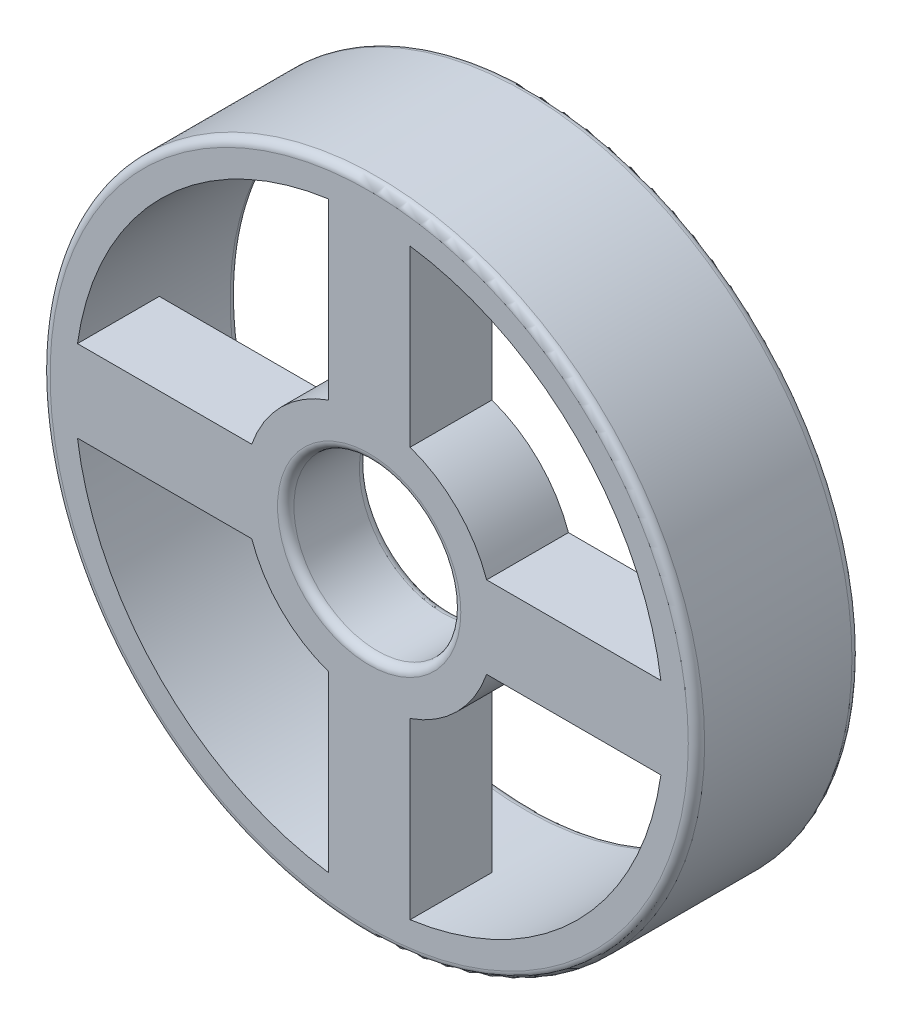
ISO-10303-21;
HEADER;
FILE_DESCRIPTION(('STEP AP214'),'2;1');
FILE_NAME('part.step','',(''),(''),'','','');
FILE_SCHEMA(('AUTOMOTIVE_DESIGN { 1 0 10303 214 1 1 1 1 }'));
ENDSEC;
DATA;
#1=APPLICATION_CONTEXT('core data for automotive mechanical design processes');
#2=APPLICATION_PROTOCOL_DEFINITION('international standard','automotive_design',2000,#1);
#3=PRODUCT_CONTEXT('',#1,'mechanical');
#4=PRODUCT('Part','Part','',(#3));
#5=PRODUCT_RELATED_PRODUCT_CATEGORY('part','',(#4));
#6=PRODUCT_DEFINITION_FORMATION('','',#4);
#7=PRODUCT_DEFINITION_CONTEXT('part definition',#1,'design');
#8=PRODUCT_DEFINITION('design','',#6,#7);
#9=PRODUCT_DEFINITION_SHAPE('','',#8);
#10=(LENGTH_UNIT() NAMED_UNIT(*) SI_UNIT(.MILLI.,.METRE.));
#11=(NAMED_UNIT(*) PLANE_ANGLE_UNIT() SI_UNIT($,.RADIAN.));
#12=(NAMED_UNIT(*) SI_UNIT($,.STERADIAN.) SOLID_ANGLE_UNIT());
#13=UNCERTAINTY_MEASURE_WITH_UNIT(LENGTH_MEASURE(1.E-05),#10,'distance_accuracy_value','');
#14=(GEOMETRIC_REPRESENTATION_CONTEXT(3) GLOBAL_UNCERTAINTY_ASSIGNED_CONTEXT((#13)) GLOBAL_UNIT_ASSIGNED_CONTEXT((#10,
#11,#12)) REPRESENTATION_CONTEXT('',''));
#15=CARTESIAN_POINT('',(0.,0.,0.));
#16=DIRECTION('',(0.,0.,1.));
#17=DIRECTION('',(1.,0.,0.));
#18=AXIS2_PLACEMENT_3D('',#15,#16,#17);
#19=CARTESIAN_POINT('',(-2.5,17.8255434699759,0.));
#20=DIRECTION('',(1.,0.,0.));
#21=DIRECTION('',(0.,1.,0.));
#22=AXIS2_PLACEMENT_3D('',#19,#20,#21);
#23=PLANE('',#22);
#24=DIRECTION('',(0.,1.,0.));
#25=VECTOR('',#24,1.);
#26=CARTESIAN_POINT('',(-2.5,17.8255434699759,5.));
#27=LINE('',#26,#25);
#28=CARTESIAN_POINT('',(-2.5,7.17704674639924,5.));
#29=VERTEX_POINT('',#28);
#30=CARTESIAN_POINT('',(-2.5,17.8255434699759,5.));
#31=VERTEX_POINT('',#30);
#32=EDGE_CURVE('E284',#29,#31,#27,.T.);
#33=ORIENTED_EDGE('',*,*,#32,.F.);
#34=DIRECTION('',(0.,0.,1.));
#35=VECTOR('',#34,1.);
#36=CARTESIAN_POINT('',(-2.5,7.17704674639924,0.));
#37=LINE('',#36,#35);
#38=CARTESIAN_POINT('',(-2.5,7.17704674639924,10.));
#39=VERTEX_POINT('',#38);
#40=EDGE_CURVE('E185',#29,#39,#37,.T.);
#41=ORIENTED_EDGE('',*,*,#40,.T.);
#42=DIRECTION('',(0.,1.,0.));
#43=VECTOR('',#42,1.);
#44=CARTESIAN_POINT('',(-2.5,17.8255434699759,10.));
#45=LINE('',#44,#43);
#46=CARTESIAN_POINT('',(-2.5,17.8255434699759,10.));
#47=VERTEX_POINT('',#46);
#48=EDGE_CURVE('E181',#39,#47,#45,.T.);
#49=ORIENTED_EDGE('',*,*,#48,.T.);
#50=DIRECTION('',(0.,0.,1.));
#51=VECTOR('',#50,1.);
#52=CARTESIAN_POINT('',(-2.5,17.8255434699759,0.));
#53=LINE('',#52,#51);
#54=EDGE_CURVE('E196',#31,#47,#53,.T.);
#55=ORIENTED_EDGE('',*,*,#54,.F.);
#56=EDGE_LOOP('',(#33,#41,#49,#55));
#57=FACE_BOUND('',#56,.T.);
#58=ADVANCED_FACE('F39',(#57),#23,.F.);
#59=CARTESIAN_POINT('',(1.06251812903579E-13,-1.06685493772574E-13,0.));
#60=DIRECTION('',(0.,0.,1.));
#61=DIRECTION('',(1.,0.,0.));
#62=AXIS2_PLACEMENT_3D('',#59,#60,#61);
#63=CYLINDRICAL_SURFACE('',#62,7.60000000000013);
#64=CARTESIAN_POINT('',(1.06251812903579E-13,-1.06685493772574E-13,5.));
#65=DIRECTION('',(0.,0.,-1.));
#66=DIRECTION('',(-1.,0.,0.));
#67=AXIS2_PLACEMENT_3D('',#64,#65,#66);
#68=CIRCLE('',#67,7.60000000000013);
#69=CARTESIAN_POINT('',(-7.17704674639924,2.50000000000001,5.));
#70=VERTEX_POINT('',#69);
#71=EDGE_CURVE('E173',#70,#29,#68,.T.);
#72=ORIENTED_EDGE('',*,*,#71,.F.);
#73=DIRECTION('',(0.,0.,1.));
#74=VECTOR('',#73,1.);
#75=CARTESIAN_POINT('',(-7.17704674639924,2.50000000000001,0.));
#76=LINE('',#75,#74);
#77=CARTESIAN_POINT('',(-7.17704674639924,2.50000000000001,10.));
#78=VERTEX_POINT('',#77);
#79=EDGE_CURVE('E171',#70,#78,#76,.T.);
#80=ORIENTED_EDGE('',*,*,#79,.T.);
#81=CARTESIAN_POINT('',(1.06251812903579E-13,-1.06685493772574E-13,10.));
#82=DIRECTION('',(0.,0.,-1.));
#83=DIRECTION('',(-1.,0.,0.));
#84=AXIS2_PLACEMENT_3D('',#81,#82,#83);
#85=CIRCLE('',#84,7.60000000000013);
#86=EDGE_CURVE('E188',#78,#39,#85,.T.);
#87=ORIENTED_EDGE('',*,*,#86,.T.);
#88=ORIENTED_EDGE('',*,*,#40,.F.);
#89=EDGE_LOOP('',(#72,#80,#87,#88));
#90=FACE_BOUND('',#89,.T.);
#91=ADVANCED_FACE('F286',(#90),#63,.T.);
#92=CARTESIAN_POINT('',(-7.17704674639924,2.50000000000001,0.));
#93=DIRECTION('',(0.,-1.,0.));
#94=DIRECTION('',(0.,0.,-1.));
#95=AXIS2_PLACEMENT_3D('',#92,#93,#94);
#96=PLANE('',#95);
#97=DIRECTION('',(1.,0.,0.));
#98=VECTOR('',#97,1.);
#99=CARTESIAN_POINT('',(-7.17704674639924,2.50000000000001,5.));
#100=LINE('',#99,#98);
#101=CARTESIAN_POINT('',(-17.825543469976,2.50000000000001,5.));
#102=VERTEX_POINT('',#101);
#103=EDGE_CURVE('E155',#102,#70,#100,.T.);
#104=ORIENTED_EDGE('',*,*,#103,.F.);
#105=DIRECTION('',(0.,0.,1.));
#106=VECTOR('',#105,1.);
#107=CARTESIAN_POINT('',(-17.8255434699759,2.50000000000001,0.));
#108=LINE('',#107,#106);
#109=CARTESIAN_POINT('',(-17.8255434699759,2.50000000000001,10.));
#110=VERTEX_POINT('',#109);
#111=EDGE_CURVE('E169',#102,#110,#108,.T.);
#112=ORIENTED_EDGE('',*,*,#111,.T.);
#113=DIRECTION('',(1.,0.,0.));
#114=VECTOR('',#113,1.);
#115=CARTESIAN_POINT('',(-7.17704674639924,2.50000000000001,10.));
#116=LINE('',#115,#114);
#117=EDGE_CURVE('E263',#110,#78,#116,.T.);
#118=ORIENTED_EDGE('',*,*,#117,.T.);
#119=ORIENTED_EDGE('',*,*,#79,.F.);
#120=EDGE_LOOP('',(#104,#112,#118,#119));
#121=FACE_BOUND('',#120,.T.);
#122=ADVANCED_FACE('F167',(#121),#96,.F.);
#123=CARTESIAN_POINT('',(1.45283091113058E-13,1.45283091113058E-13,0.));
#124=DIRECTION('',(0.,0.,1.));
#125=DIRECTION('',(1.,0.,0.));
#126=AXIS2_PLACEMENT_3D('',#123,#124,#125);
#127=CYLINDRICAL_SURFACE('',#126,7.60000000000018);
#128=CARTESIAN_POINT('',(1.45283091113058E-13,1.45283091113058E-13,5.));
#129=DIRECTION('',(0.,0.,-1.));
#130=DIRECTION('',(-1.,0.,0.));
#131=AXIS2_PLACEMENT_3D('',#128,#129,#130);
#132=CIRCLE('',#131,7.60000000000018);
#133=CARTESIAN_POINT('',(-2.50000000000001,-7.17704674639924,5.));
#134=VERTEX_POINT('',#133);
#135=CARTESIAN_POINT('',(-7.17704674639924,-2.50000000000001,5.));
#136=VERTEX_POINT('',#135);
#137=EDGE_CURVE('E392',#134,#136,#132,.T.);
#138=ORIENTED_EDGE('',*,*,#137,.F.);
#139=DIRECTION('',(0.,0.,1.));
#140=VECTOR('',#139,1.);
#141=CARTESIAN_POINT('',(-2.50000000000001,-7.17704674639924,0.));
#142=LINE('',#141,#140);
#143=CARTESIAN_POINT('',(-2.50000000000001,-7.17704674639924,10.));
#144=VERTEX_POINT('',#143);
#145=EDGE_CURVE('E296',#134,#144,#142,.T.);
#146=ORIENTED_EDGE('',*,*,#145,.T.);
#147=CARTESIAN_POINT('',(1.45283091113058E-13,1.45283091113058E-13,10.));
#148=DIRECTION('',(0.,0.,-1.));
#149=DIRECTION('',(-1.,0.,0.));
#150=AXIS2_PLACEMENT_3D('',#147,#148,#149);
#151=CIRCLE('',#150,7.60000000000018);
#152=CARTESIAN_POINT('',(-7.17704674639924,-2.50000000000001,10.));
#153=VERTEX_POINT('',#152);
#154=EDGE_CURVE('E260',#144,#153,#151,.T.);
#155=ORIENTED_EDGE('',*,*,#154,.T.);
#156=DIRECTION('',(0.,0.,1.));
#157=VECTOR('',#156,1.);
#158=CARTESIAN_POINT('',(-7.17704674639924,-2.50000000000001,0.));
#159=LINE('',#158,#157);
#160=EDGE_CURVE('E334',#136,#153,#159,.T.);
#161=ORIENTED_EDGE('',*,*,#160,.F.);
#162=EDGE_LOOP('',(#138,#146,#155,#161));
#163=FACE_BOUND('',#162,.T.);
#164=ADVANCED_FACE('F403',(#163),#127,.T.);
#165=CARTESIAN_POINT('',(-2.50000000000001,-7.17704674639924,0.));
#166=DIRECTION('',(1.,0.,0.));
#167=DIRECTION('',(0.,0.,-1.));
#168=AXIS2_PLACEMENT_3D('',#165,#166,#167);
#169=PLANE('',#168);
#170=DIRECTION('',(0.,1.,0.));
#171=VECTOR('',#170,1.);
#172=CARTESIAN_POINT('',(-2.50000000000001,-7.17704674639924,5.));
#173=LINE('',#172,#171);
#174=CARTESIAN_POINT('',(-2.50000000000003,-17.825543469976,5.));
#175=VERTEX_POINT('',#174);
#176=EDGE_CURVE('E174',#175,#134,#173,.T.);
#177=ORIENTED_EDGE('',*,*,#176,.F.);
#178=DIRECTION('',(0.,0.,1.));
#179=VECTOR('',#178,1.);
#180=CARTESIAN_POINT('',(-2.50000000000002,-17.8255434699759,0.));
#181=LINE('',#180,#179);
#182=CARTESIAN_POINT('',(-2.50000000000002,-17.8255434699759,10.));
#183=VERTEX_POINT('',#182);
#184=EDGE_CURVE('E337',#175,#183,#181,.T.);
#185=ORIENTED_EDGE('',*,*,#184,.T.);
#186=DIRECTION('',(0.,1.,0.));
#187=VECTOR('',#186,1.);
#188=CARTESIAN_POINT('',(-2.50000000000001,-7.17704674639924,10.));
#189=LINE('',#188,#187);
#190=EDGE_CURVE('E330',#183,#144,#189,.T.);
#191=ORIENTED_EDGE('',*,*,#190,.T.);
#192=ORIENTED_EDGE('',*,*,#145,.F.);
#193=EDGE_LOOP('',(#177,#185,#191,#192));
#194=FACE_BOUND('',#193,.T.);
#195=ADVANCED_FACE('F404',(#194),#169,.F.);
#196=CARTESIAN_POINT('',(-7.17704674639924,-2.50000000000001,0.));
#197=DIRECTION('',(0.,1.,0.));
#198=DIRECTION('',(0.,0.,1.));
#199=AXIS2_PLACEMENT_3D('',#196,#197,#198);
#200=PLANE('',#199);
#201=DIRECTION('',(-1.,0.,0.));
#202=VECTOR('',#201,1.);
#203=CARTESIAN_POINT('',(-7.17704674639924,-2.50000000000001,5.));
#204=LINE('',#203,#202);
#205=CARTESIAN_POINT('',(-17.825543469976,-2.50000000000001,5.));
#206=VERTEX_POINT('',#205);
#207=EDGE_CURVE('E158',#136,#206,#204,.T.);
#208=ORIENTED_EDGE('',*,*,#207,.F.);
#209=ORIENTED_EDGE('',*,*,#160,.T.);
#210=DIRECTION('',(-1.,0.,0.));
#211=VECTOR('',#210,1.);
#212=CARTESIAN_POINT('',(-7.17704674639924,-2.50000000000001,10.));
#213=LINE('',#212,#211);
#214=CARTESIAN_POINT('',(-17.8255434699759,-2.50000000000001,10.));
#215=VERTEX_POINT('',#214);
#216=EDGE_CURVE('E322',#153,#215,#213,.T.);
#217=ORIENTED_EDGE('',*,*,#216,.T.);
#218=DIRECTION('',(0.,0.,1.));
#219=VECTOR('',#218,1.);
#220=CARTESIAN_POINT('',(-17.8255434699759,-2.50000000000001,0.));
#221=LINE('',#220,#219);
#222=EDGE_CURVE('E340',#206,#215,#221,.T.);
#223=ORIENTED_EDGE('',*,*,#222,.F.);
#224=EDGE_LOOP('',(#208,#209,#217,#223));
#225=FACE_BOUND('',#224,.T.);
#226=ADVANCED_FACE('F407',(#225),#200,.F.);
#227=CARTESIAN_POINT('',(0.,0.,0.));
#228=DIRECTION('',(0.,0.,1.));
#229=DIRECTION('',(1.,0.,0.));
#230=AXIS2_PLACEMENT_3D('',#227,#228,#229);
#231=CYLINDRICAL_SURFACE('',#230,7.6);
#232=CARTESIAN_POINT('',(0.,0.,5.));
#233=DIRECTION('',(0.,0.,-1.));
#234=DIRECTION('',(-1.,0.,0.));
#235=AXIS2_PLACEMENT_3D('',#232,#233,#234);
#236=CIRCLE('',#235,7.6);
#237=CARTESIAN_POINT('',(7.17704674639924,-2.50000000000001,5.));
#238=VERTEX_POINT('',#237);
#239=CARTESIAN_POINT('',(2.50000000000001,-7.17704674639924,5.));
#240=VERTEX_POINT('',#239);
#241=EDGE_CURVE('E381',#238,#240,#236,.T.);
#242=ORIENTED_EDGE('',*,*,#241,.F.);
#243=DIRECTION('',(0.,0.,1.));
#244=VECTOR('',#243,1.);
#245=CARTESIAN_POINT('',(7.17704674639924,-2.50000000000001,0.));
#246=LINE('',#245,#244);
#247=CARTESIAN_POINT('',(7.17704674639924,-2.50000000000001,10.));
#248=VERTEX_POINT('',#247);
#249=EDGE_CURVE('E309',#238,#248,#246,.T.);
#250=ORIENTED_EDGE('',*,*,#249,.T.);
#251=CARTESIAN_POINT('',(0.,0.,10.));
#252=DIRECTION('',(0.,0.,-1.));
#253=DIRECTION('',(1.,0.,0.));
#254=AXIS2_PLACEMENT_3D('',#251,#252,#253);
#255=CIRCLE('',#254,7.6);
#256=CARTESIAN_POINT('',(2.50000000000001,-7.17704674639924,10.));
#257=VERTEX_POINT('',#256);
#258=EDGE_CURVE('E254',#248,#257,#255,.T.);
#259=ORIENTED_EDGE('',*,*,#258,.T.);
#260=DIRECTION('',(0.,0.,1.));
#261=VECTOR('',#260,1.);
#262=CARTESIAN_POINT('',(2.50000000000001,-7.17704674639924,0.));
#263=LINE('',#262,#261);
#264=EDGE_CURVE('E308',#240,#257,#263,.T.);
#265=ORIENTED_EDGE('',*,*,#264,.F.);
#266=EDGE_LOOP('',(#242,#250,#259,#265));
#267=FACE_BOUND('',#266,.T.);
#268=ADVANCED_FACE('F409',(#267),#231,.T.);
#269=CARTESIAN_POINT('',(7.17704674639924,-2.50000000000001,0.));
#270=DIRECTION('',(0.,1.,0.));
#271=DIRECTION('',(0.,0.,1.));
#272=AXIS2_PLACEMENT_3D('',#269,#270,#271);
#273=PLANE('',#272);
#274=DIRECTION('',(-1.,0.,0.));
#275=VECTOR('',#274,1.);
#276=CARTESIAN_POINT('',(7.17704674639924,-2.50000000000001,5.));
#277=LINE('',#276,#275);
#278=CARTESIAN_POINT('',(17.8255434699759,-2.50000000000001,5.));
#279=VERTEX_POINT('',#278);
#280=EDGE_CURVE('E387',#279,#238,#277,.T.);
#281=ORIENTED_EDGE('',*,*,#280,.F.);
#282=DIRECTION('',(0.,0.,1.));
#283=VECTOR('',#282,1.);
#284=CARTESIAN_POINT('',(17.8255434699759,-2.50000000000001,0.));
#285=LINE('',#284,#283);
#286=CARTESIAN_POINT('',(17.8255434699759,-2.50000000000001,10.));
#287=VERTEX_POINT('',#286);
#288=EDGE_CURVE('E312',#279,#287,#285,.T.);
#289=ORIENTED_EDGE('',*,*,#288,.T.);
#290=DIRECTION('',(-1.,0.,0.));
#291=VECTOR('',#290,1.);
#292=CARTESIAN_POINT('',(7.17704674639924,-2.50000000000001,10.));
#293=LINE('',#292,#291);
#294=EDGE_CURVE('E304',#287,#248,#293,.T.);
#295=ORIENTED_EDGE('',*,*,#294,.T.);
#296=ORIENTED_EDGE('',*,*,#249,.F.);
#297=EDGE_LOOP('',(#281,#289,#295,#296));
#298=FACE_BOUND('',#297,.T.);
#299=ADVANCED_FACE('F415',(#298),#273,.F.);
#300=CARTESIAN_POINT('',(2.50000000000001,-7.17704674639924,0.));
#301=DIRECTION('',(-1.,0.,0.));
#302=DIRECTION('',(0.,-1.,0.));
#303=AXIS2_PLACEMENT_3D('',#300,#301,#302);
#304=PLANE('',#303);
#305=DIRECTION('',(0.,-1.,0.));
#306=VECTOR('',#305,1.);
#307=CARTESIAN_POINT('',(2.50000000000001,-7.17704674639924,5.));
#308=LINE('',#307,#306);
#309=CARTESIAN_POINT('',(2.50000000000001,-17.825543469976,5.));
#310=VERTEX_POINT('',#309);
#311=EDGE_CURVE('E377',#240,#310,#308,.T.);
#312=ORIENTED_EDGE('',*,*,#311,.F.);
#313=ORIENTED_EDGE('',*,*,#264,.T.);
#314=DIRECTION('',(0.,-1.,0.));
#315=VECTOR('',#314,1.);
#316=CARTESIAN_POINT('',(2.50000000000001,-7.17704674639924,10.));
#317=LINE('',#316,#315);
#318=CARTESIAN_POINT('',(2.50000000000002,-17.8255434699759,10.));
#319=VERTEX_POINT('',#318);
#320=EDGE_CURVE('E295',#257,#319,#317,.T.);
#321=ORIENTED_EDGE('',*,*,#320,.T.);
#322=DIRECTION('',(0.,0.,1.));
#323=VECTOR('',#322,1.);
#324=CARTESIAN_POINT('',(2.50000000000002,-17.8255434699759,0.));
#325=LINE('',#324,#323);
#326=EDGE_CURVE('E315',#310,#319,#325,.T.);
#327=ORIENTED_EDGE('',*,*,#326,.F.);
#328=EDGE_LOOP('',(#312,#313,#321,#327));
#329=FACE_BOUND('',#328,.T.);
#330=ADVANCED_FACE('F528',(#329),#304,.F.);
#331=CARTESIAN_POINT('',(0.,0.,0.));
#332=DIRECTION('',(0.,0.,1.));
#333=DIRECTION('',(1.,0.,0.));
#334=AXIS2_PLACEMENT_3D('',#331,#332,#333);
#335=CYLINDRICAL_SURFACE('',#334,5.1);
#336=CARTESIAN_POINT('',(0.,0.,5.5));
#337=DIRECTION('',(0.,0.,-1.));
#338=DIRECTION('',(-1.,0.,0.));
#339=AXIS2_PLACEMENT_3D('',#336,#337,#338);
#340=CIRCLE('',#339,5.1);
#341=CARTESIAN_POINT('',(-5.1,0.,5.5));
#342=VERTEX_POINT('',#341);
#343=EDGE_CURVE('E204',#342,#342,#340,.T.);
#344=ORIENTED_EDGE('',*,*,#343,.T.);
#345=EDGE_LOOP('',(#344));
#346=FACE_BOUND('',#345,.T.);
#347=CARTESIAN_POINT('',(0.,0.,9.5));
#348=DIRECTION('',(0.,0.,1.));
#349=DIRECTION('',(1.,0.,0.));
#350=AXIS2_PLACEMENT_3D('',#347,#348,#349);
#351=CIRCLE('',#350,5.1);
#352=CARTESIAN_POINT('',(5.1,0.,9.5));
#353=VERTEX_POINT('',#352);
#354=EDGE_CURVE('E200',#353,#353,#351,.T.);
#355=ORIENTED_EDGE('',*,*,#354,.T.);
#356=EDGE_LOOP('',(#355));
#357=FACE_BOUND('',#356,.T.);
#358=ADVANCED_FACE('F427',(#346,#357),#335,.F.);
#359=CARTESIAN_POINT('',(7.17704674639924,2.50000000000001,0.));
#360=DIRECTION('',(0.,-1.,0.));
#361=DIRECTION('',(0.,0.,-1.));
#362=AXIS2_PLACEMENT_3D('',#359,#360,#361);
#363=PLANE('',#362);
#364=DIRECTION('',(1.,0.,0.));
#365=VECTOR('',#364,1.);
#366=CARTESIAN_POINT('',(7.17704674639924,2.50000000000001,5.));
#367=LINE('',#366,#365);
#368=CARTESIAN_POINT('',(7.17704674639924,2.50000000000001,5.));
#369=VERTEX_POINT('',#368);
#370=CARTESIAN_POINT('',(17.8255434699759,2.50000000000001,5.));
#371=VERTEX_POINT('',#370);
#372=EDGE_CURVE('E374',#369,#371,#367,.T.);
#373=ORIENTED_EDGE('',*,*,#372,.F.);
#374=DIRECTION('',(0.,0.,1.));
#375=VECTOR('',#374,1.);
#376=CARTESIAN_POINT('',(7.17704674639924,2.50000000000001,0.));
#377=LINE('',#376,#375);
#378=CARTESIAN_POINT('',(7.17704674639924,2.50000000000001,10.));
#379=VERTEX_POINT('',#378);
#380=EDGE_CURVE('E270',#369,#379,#377,.T.);
#381=ORIENTED_EDGE('',*,*,#380,.T.);
#382=DIRECTION('',(1.,0.,0.));
#383=VECTOR('',#382,1.);
#384=CARTESIAN_POINT('',(7.17704674639924,2.50000000000001,10.));
#385=LINE('',#384,#383);
#386=CARTESIAN_POINT('',(17.8255434699759,2.50000000000001,10.));
#387=VERTEX_POINT('',#386);
#388=EDGE_CURVE('E354',#379,#387,#385,.T.);
#389=ORIENTED_EDGE('',*,*,#388,.T.);
#390=DIRECTION('',(0.,0.,1.));
#391=VECTOR('',#390,1.);
#392=CARTESIAN_POINT('',(17.8255434699759,2.50000000000001,0.));
#393=LINE('',#392,#391);
#394=EDGE_CURVE('E265',#371,#387,#393,.T.);
#395=ORIENTED_EDGE('',*,*,#394,.F.);
#396=EDGE_LOOP('',(#373,#381,#389,#395));
#397=FACE_BOUND('',#396,.T.);
#398=ADVANCED_FACE('F373',(#397),#363,.F.);
#399=CARTESIAN_POINT('',(-1.24032728532342E-13,-1.24466409401336E-13,0.));
#400=DIRECTION('',(0.,0.,1.));
#401=DIRECTION('',(1.,0.,0.));
#402=AXIS2_PLACEMENT_3D('',#399,#400,#401);
#403=CYLINDRICAL_SURFACE('',#402,7.60000000000016);
#404=CARTESIAN_POINT('',(-1.24032728532342E-13,-1.24466409401336E-13,5.));
#405=DIRECTION('',(0.,0.,-1.));
#406=DIRECTION('',(-1.,0.,0.));
#407=AXIS2_PLACEMENT_3D('',#404,#405,#406);
#408=CIRCLE('',#407,7.60000000000016);
#409=CARTESIAN_POINT('',(2.5,7.17704674639925,5.));
#410=VERTEX_POINT('',#409);
#411=EDGE_CURVE('E368',#410,#369,#408,.T.);
#412=ORIENTED_EDGE('',*,*,#411,.F.);
#413=DIRECTION('',(0.,0.,1.));
#414=VECTOR('',#413,1.);
#415=CARTESIAN_POINT('',(2.5,7.17704674639924,0.));
#416=LINE('',#415,#414);
#417=CARTESIAN_POINT('',(2.5,7.17704674639924,10.));
#418=VERTEX_POINT('',#417);
#419=EDGE_CURVE('E359',#410,#418,#416,.T.);
#420=ORIENTED_EDGE('',*,*,#419,.T.);
#421=CARTESIAN_POINT('',(-1.24032728532342E-13,-1.24466409401336E-13,10.));
#422=DIRECTION('',(0.,0.,-1.));
#423=DIRECTION('',(-1.,0.,0.));
#424=AXIS2_PLACEMENT_3D('',#421,#422,#423);
#425=CIRCLE('',#424,7.60000000000016);
#426=EDGE_CURVE('E350',#418,#379,#425,.T.);
#427=ORIENTED_EDGE('',*,*,#426,.T.);
#428=ORIENTED_EDGE('',*,*,#380,.F.);
#429=EDGE_LOOP('',(#412,#420,#427,#428));
#430=FACE_BOUND('',#429,.T.);
#431=ADVANCED_FACE('F365',(#430),#403,.T.);
#432=CARTESIAN_POINT('',(2.5,17.8255434699759,0.));
#433=DIRECTION('',(-1.,0.,0.));
#434=DIRECTION('',(0.,-1.,0.));
#435=AXIS2_PLACEMENT_3D('',#432,#433,#434);
#436=PLANE('',#435);
#437=DIRECTION('',(0.,-1.,0.));
#438=VECTOR('',#437,1.);
#439=CARTESIAN_POINT('',(2.5,17.8255434699759,5.));
#440=LINE('',#439,#438);
#441=CARTESIAN_POINT('',(2.5,17.8255434699759,5.));
#442=VERTEX_POINT('',#441);
#443=EDGE_CURVE('E192',#442,#410,#440,.T.);
#444=ORIENTED_EDGE('',*,*,#443,.F.);
#445=DIRECTION('',(0.,0.,1.));
#446=VECTOR('',#445,1.);
#447=CARTESIAN_POINT('',(2.5,17.8255434699759,0.));
#448=LINE('',#447,#446);
#449=CARTESIAN_POINT('',(2.5,17.8255434699759,10.));
#450=VERTEX_POINT('',#449);
#451=EDGE_CURVE('E62',#442,#450,#448,.T.);
#452=ORIENTED_EDGE('',*,*,#451,.T.);
#453=DIRECTION('',(0.,-1.,0.));
#454=VECTOR('',#453,1.);
#455=CARTESIAN_POINT('',(2.5,17.8255434699759,10.));
#456=LINE('',#455,#454);
#457=EDGE_CURVE('E347',#450,#418,#456,.T.);
#458=ORIENTED_EDGE('',*,*,#457,.T.);
#459=ORIENTED_EDGE('',*,*,#419,.F.);
#460=EDGE_LOOP('',(#444,#452,#458,#459));
#461=FACE_BOUND('',#460,.T.);
#462=ADVANCED_FACE('F369',(#461),#436,.F.);
#463=CARTESIAN_POINT('',(0.,0.,10.));
#464=DIRECTION('',(0.,0.,-1.));
#465=DIRECTION('',(-1.,0.,0.));
#466=AXIS2_PLACEMENT_3D('',#463,#464,#465);
#467=CYLINDRICAL_SURFACE('',#466,20.);
#468=CARTESIAN_POINT('',(0.,0.,0.5));
#469=DIRECTION('',(0.,0.,1.));
#470=DIRECTION('',(1.,0.,0.));
#471=AXIS2_PLACEMENT_3D('',#468,#469,#470);
#472=CIRCLE('',#471,20.);
#473=CARTESIAN_POINT('',(20.,0.,0.5));
#474=VERTEX_POINT('',#473);
#475=EDGE_CURVE('E11',#474,#474,#472,.T.);
#476=ORIENTED_EDGE('',*,*,#475,.T.);
#477=EDGE_LOOP('',(#476));
#478=FACE_BOUND('',#477,.T.);
#479=CARTESIAN_POINT('',(0.,0.,9.5));
#480=DIRECTION('',(0.,0.,1.));
#481=DIRECTION('',(1.,0.,0.));
#482=AXIS2_PLACEMENT_3D('',#479,#480,#481);
#483=CIRCLE('',#482,20.);
#484=CARTESIAN_POINT('',(20.,0.,9.5));
#485=VERTEX_POINT('',#484);
#486=EDGE_CURVE('E48',#485,#485,#483,.F.);
#487=ORIENTED_EDGE('',*,*,#486,.T.);
#488=EDGE_LOOP('',(#487));
#489=FACE_BOUND('',#488,.T.);
#490=ADVANCED_FACE('F231',(#478,#489),#467,.T.);
#491=CARTESIAN_POINT('',(0.,0.,10.));
#492=DIRECTION('',(0.,0.,1.));
#493=DIRECTION('',(1.,0.,0.));
#494=AXIS2_PLACEMENT_3D('',#491,#492,#493);
#495=PLANE('',#494);
#496=CARTESIAN_POINT('',(0.,0.,10.));
#497=DIRECTION('',(0.,0.,1.));
#498=DIRECTION('',(1.,0.,0.));
#499=AXIS2_PLACEMENT_3D('',#496,#497,#498);
#500=CIRCLE('',#499,5.6);
#501=CARTESIAN_POINT('',(5.6,0.,10.));
#502=VERTEX_POINT('',#501);
#503=EDGE_CURVE('E212',#502,#502,#500,.F.);
#504=ORIENTED_EDGE('',*,*,#503,.T.);
#505=EDGE_LOOP('',(#504));
#506=FACE_BOUND('',#505,.T.);
#507=CARTESIAN_POINT('',(0.,0.,10.));
#508=DIRECTION('',(0.,0.,1.));
#509=DIRECTION('',(1.,0.,0.));
#510=AXIS2_PLACEMENT_3D('',#507,#508,#509);
#511=CIRCLE('',#510,19.5);
#512=CARTESIAN_POINT('',(19.5,0.,10.));
#513=VERTEX_POINT('',#512);
#514=EDGE_CURVE('E208',#513,#513,#511,.T.);
#515=ORIENTED_EDGE('',*,*,#514,.T.);
#516=EDGE_LOOP('',(#515));
#517=FACE_BOUND('',#516,.T.);
#518=CARTESIAN_POINT('',(0.,0.,10.));
#519=DIRECTION('',(0.,0.,1.));
#520=DIRECTION('',(-1.,0.,0.));
#521=AXIS2_PLACEMENT_3D('',#518,#519,#520);
#522=CIRCLE('',#521,18.);
#523=EDGE_CURVE('E248',#387,#450,#522,.T.);
#524=ORIENTED_EDGE('',*,*,#523,.F.);
#525=ORIENTED_EDGE('',*,*,#388,.F.);
#526=ORIENTED_EDGE('',*,*,#426,.F.);
#527=ORIENTED_EDGE('',*,*,#457,.F.);
#528=EDGE_LOOP('',(#524,#525,#526,#527));
#529=FACE_BOUND('',#528,.T.);
#530=ORIENTED_EDGE('',*,*,#258,.F.);
#531=ORIENTED_EDGE('',*,*,#294,.F.);
#532=CARTESIAN_POINT('',(0.,0.,10.));
#533=DIRECTION('',(0.,0.,1.));
#534=DIRECTION('',(1.,0.,0.));
#535=AXIS2_PLACEMENT_3D('',#532,#533,#534);
#536=CIRCLE('',#535,18.0000000000001);
#537=EDGE_CURVE('E300',#319,#287,#536,.T.);
#538=ORIENTED_EDGE('',*,*,#537,.F.);
#539=ORIENTED_EDGE('',*,*,#320,.F.);
#540=EDGE_LOOP('',(#530,#531,#538,#539));
#541=FACE_BOUND('',#540,.T.);
#542=ORIENTED_EDGE('',*,*,#154,.F.);
#543=ORIENTED_EDGE('',*,*,#190,.F.);
#544=CARTESIAN_POINT('',(0.,0.,10.));
#545=DIRECTION('',(0.,0.,1.));
#546=DIRECTION('',(-1.,0.,0.));
#547=AXIS2_PLACEMENT_3D('',#544,#545,#546);
#548=CIRCLE('',#547,17.9999999999999);
#549=EDGE_CURVE('E326',#215,#183,#548,.T.);
#550=ORIENTED_EDGE('',*,*,#549,.F.);
#551=ORIENTED_EDGE('',*,*,#216,.F.);
#552=EDGE_LOOP('',(#542,#543,#550,#551));
#553=FACE_BOUND('',#552,.T.);
#554=CARTESIAN_POINT('',(0.,0.,10.));
#555=DIRECTION('',(0.,0.,1.));
#556=DIRECTION('',(-1.,0.,0.));
#557=AXIS2_PLACEMENT_3D('',#554,#555,#556);
#558=CIRCLE('',#557,18.);
#559=EDGE_CURVE('E178',#47,#110,#558,.T.);
#560=ORIENTED_EDGE('',*,*,#559,.F.);
#561=ORIENTED_EDGE('',*,*,#48,.F.);
#562=ORIENTED_EDGE('',*,*,#86,.F.);
#563=ORIENTED_EDGE('',*,*,#117,.F.);
#564=EDGE_LOOP('',(#560,#561,#562,#563));
#565=FACE_BOUND('',#564,.T.);
#566=ADVANCED_FACE('F238',(#506,#517,#529,#541,#553,#565),#495,.T.);
#567=CARTESIAN_POINT('',(0.,0.,0.));
#568=DIRECTION('',(0.,0.,1.));
#569=DIRECTION('',(1.,0.,0.));
#570=AXIS2_PLACEMENT_3D('',#567,#568,#569);
#571=PLANE('',#570);
#572=CARTESIAN_POINT('',(0.,0.,0.));
#573=DIRECTION('',(0.,0.,1.));
#574=DIRECTION('',(1.,0.,0.));
#575=AXIS2_PLACEMENT_3D('',#572,#573,#574);
#576=CIRCLE('',#575,18.5);
#577=CARTESIAN_POINT('',(18.5,0.,0.));
#578=VERTEX_POINT('',#577);
#579=EDGE_CURVE('E220',#578,#578,#576,.T.);
#580=ORIENTED_EDGE('',*,*,#579,.T.);
#581=EDGE_LOOP('',(#580));
#582=FACE_BOUND('',#581,.T.);
#583=CARTESIAN_POINT('',(0.,0.,0.));
#584=DIRECTION('',(0.,0.,1.));
#585=DIRECTION('',(1.,0.,0.));
#586=AXIS2_PLACEMENT_3D('',#583,#584,#585);
#587=CIRCLE('',#586,19.5);
#588=CARTESIAN_POINT('',(19.5,0.,0.));
#589=VERTEX_POINT('',#588);
#590=EDGE_CURVE('E216',#589,#589,#587,.F.);
#591=ORIENTED_EDGE('',*,*,#590,.T.);
#592=EDGE_LOOP('',(#591));
#593=FACE_BOUND('',#592,.T.);
#594=ADVANCED_FACE('F241',(#582,#593),#571,.F.);
#595=CARTESIAN_POINT('',(0.,0.,0.));
#596=DIRECTION('',(0.,0.,1.));
#597=DIRECTION('',(1.,0.,0.));
#598=AXIS2_PLACEMENT_3D('',#595,#596,#597);
#599=CYLINDRICAL_SURFACE('',#598,18.);
#600=CARTESIAN_POINT('',(0.,0.,0.5));
#601=DIRECTION('',(0.,0.,1.));
#602=DIRECTION('',(1.,0.,0.));
#603=AXIS2_PLACEMENT_3D('',#600,#601,#602);
#604=CIRCLE('',#603,18.);
#605=CARTESIAN_POINT('',(18.,0.,0.5));
#606=VERTEX_POINT('',#605);
#607=EDGE_CURVE('E224',#606,#606,#604,.F.);
#608=ORIENTED_EDGE('',*,*,#607,.T.);
#609=EDGE_LOOP('',(#608));
#610=FACE_BOUND('',#609,.T.);
#611=CARTESIAN_POINT('',(0.,0.,5.));
#612=DIRECTION('',(0.,0.,-1.));
#613=DIRECTION('',(-1.,0.,0.));
#614=AXIS2_PLACEMENT_3D('',#611,#612,#613);
#615=CIRCLE('',#614,18.);
#616=EDGE_CURVE('E55',#31,#442,#615,.T.);
#617=ORIENTED_EDGE('',*,*,#616,.F.);
#618=ORIENTED_EDGE('',*,*,#54,.T.);
#619=ORIENTED_EDGE('',*,*,#559,.T.);
#620=ORIENTED_EDGE('',*,*,#111,.F.);
#621=EDGE_CURVE('E152',#206,#102,#615,.T.);
#622=ORIENTED_EDGE('',*,*,#621,.F.);
#623=ORIENTED_EDGE('',*,*,#222,.T.);
#624=ORIENTED_EDGE('',*,*,#549,.T.);
#625=ORIENTED_EDGE('',*,*,#184,.F.);
#626=EDGE_CURVE('E163',#310,#175,#615,.T.);
#627=ORIENTED_EDGE('',*,*,#626,.F.);
#628=ORIENTED_EDGE('',*,*,#326,.T.);
#629=ORIENTED_EDGE('',*,*,#537,.T.);
#630=ORIENTED_EDGE('',*,*,#288,.F.);
#631=EDGE_CURVE('E623',#371,#279,#615,.T.);
#632=ORIENTED_EDGE('',*,*,#631,.F.);
#633=ORIENTED_EDGE('',*,*,#394,.T.);
#634=ORIENTED_EDGE('',*,*,#523,.T.);
#635=ORIENTED_EDGE('',*,*,#451,.F.);
#636=EDGE_LOOP('',(#617,#618,#619,#620,#622,#623,#624,#625,#627,#628,#629,#630,#632,#633,#634,#635));
#637=FACE_BOUND('',#636,.T.);
#638=ADVANCED_FACE('F176',(#610,#637),#599,.F.);
#639=CARTESIAN_POINT('',(0.,0.,5.));
#640=DIRECTION('',(0.,0.,-1.));
#641=DIRECTION('',(-1.,0.,0.));
#642=AXIS2_PLACEMENT_3D('',#639,#640,#641);
#643=PLANE('',#642);
#644=CARTESIAN_POINT('',(0.,0.,5.));
#645=DIRECTION('',(0.,0.,-1.));
#646=DIRECTION('',(-1.,0.,0.));
#647=AXIS2_PLACEMENT_3D('',#644,#645,#646);
#648=CIRCLE('',#647,5.6);
#649=CARTESIAN_POINT('',(-5.6,0.,5.));
#650=VERTEX_POINT('',#649);
#651=EDGE_CURVE('E195',#650,#650,#648,.F.);
#652=ORIENTED_EDGE('',*,*,#651,.T.);
#653=EDGE_LOOP('',(#652));
#654=FACE_BOUND('',#653,.T.);
#655=ORIENTED_EDGE('',*,*,#32,.T.);
#656=ORIENTED_EDGE('',*,*,#616,.T.);
#657=ORIENTED_EDGE('',*,*,#443,.T.);
#658=ORIENTED_EDGE('',*,*,#411,.T.);
#659=ORIENTED_EDGE('',*,*,#372,.T.);
#660=ORIENTED_EDGE('',*,*,#631,.T.);
#661=ORIENTED_EDGE('',*,*,#280,.T.);
#662=ORIENTED_EDGE('',*,*,#241,.T.);
#663=ORIENTED_EDGE('',*,*,#311,.T.);
#664=ORIENTED_EDGE('',*,*,#626,.T.);
#665=ORIENTED_EDGE('',*,*,#176,.T.);
#666=ORIENTED_EDGE('',*,*,#137,.T.);
#667=ORIENTED_EDGE('',*,*,#207,.T.);
#668=ORIENTED_EDGE('',*,*,#621,.T.);
#669=ORIENTED_EDGE('',*,*,#103,.T.);
#670=ORIENTED_EDGE('',*,*,#71,.T.);
#671=EDGE_LOOP('',(#655,#656,#657,#658,#659,#660,#661,#662,#663,#664,#665,#666,#667,#668,#669,#670));
#672=FACE_BOUND('',#671,.T.);
#673=ADVANCED_FACE('F154',(#654,#672),#643,.T.);
#674=CARTESIAN_POINT('',(0.,0.,5.5));
#675=DIRECTION('',(0.,0.,-1.));
#676=DIRECTION('',(-1.,0.,0.));
#677=AXIS2_PLACEMENT_3D('',#674,#675,#676);
#678=TOROIDAL_SURFACE('',#677,5.6,0.5);
#679=ORIENTED_EDGE('',*,*,#343,.F.);
#680=EDGE_LOOP('',(#679));
#681=FACE_BOUND('',#680,.T.);
#682=ORIENTED_EDGE('',*,*,#651,.F.);
#683=EDGE_LOOP('',(#682));
#684=FACE_BOUND('',#683,.T.);
#685=ADVANCED_FACE('F438',(#681,#684),#678,.T.);
#686=CARTESIAN_POINT('',(0.,0.,9.5));
#687=DIRECTION('',(0.,0.,1.));
#688=DIRECTION('',(1.,0.,0.));
#689=AXIS2_PLACEMENT_3D('',#686,#687,#688);
#690=TOROIDAL_SURFACE('',#689,5.6,0.5);
#691=ORIENTED_EDGE('',*,*,#503,.F.);
#692=EDGE_LOOP('',(#691));
#693=FACE_BOUND('',#692,.T.);
#694=ORIENTED_EDGE('',*,*,#354,.F.);
#695=EDGE_LOOP('',(#694));
#696=FACE_BOUND('',#695,.T.);
#697=ADVANCED_FACE('F441',(#693,#696),#690,.T.);
#698=CARTESIAN_POINT('',(0.,0.,0.5));
#699=DIRECTION('',(0.,0.,1.));
#700=DIRECTION('',(1.,0.,0.));
#701=AXIS2_PLACEMENT_3D('',#698,#699,#700);
#702=TOROIDAL_SURFACE('',#701,18.5,0.5);
#703=ORIENTED_EDGE('',*,*,#607,.F.);
#704=EDGE_LOOP('',(#703));
#705=FACE_BOUND('',#704,.T.);
#706=ORIENTED_EDGE('',*,*,#579,.F.);
#707=EDGE_LOOP('',(#706));
#708=FACE_BOUND('',#707,.T.);
#709=ADVANCED_FACE('F445',(#705,#708),#702,.T.);
#710=CARTESIAN_POINT('',(0.,0.,0.5));
#711=DIRECTION('',(0.,0.,1.));
#712=DIRECTION('',(1.,0.,0.));
#713=AXIS2_PLACEMENT_3D('',#710,#711,#712);
#714=TOROIDAL_SURFACE('',#713,19.5,0.5);
#715=ORIENTED_EDGE('',*,*,#590,.F.);
#716=EDGE_LOOP('',(#715));
#717=FACE_BOUND('',#716,.T.);
#718=ORIENTED_EDGE('',*,*,#475,.F.);
#719=EDGE_LOOP('',(#718));
#720=FACE_BOUND('',#719,.T.);
#721=ADVANCED_FACE('F235',(#717,#720),#714,.T.);
#722=CARTESIAN_POINT('',(0.,0.,9.5));
#723=DIRECTION('',(0.,0.,1.));
#724=DIRECTION('',(1.,0.,0.));
#725=AXIS2_PLACEMENT_3D('',#722,#723,#724);
#726=TOROIDAL_SURFACE('',#725,19.5,0.5);
#727=ORIENTED_EDGE('',*,*,#486,.F.);
#728=EDGE_LOOP('',(#727));
#729=FACE_BOUND('',#728,.T.);
#730=ORIENTED_EDGE('',*,*,#514,.F.);
#731=EDGE_LOOP('',(#730));
#732=FACE_BOUND('',#731,.T.);
#733=ADVANCED_FACE('F41',(#729,#732),#726,.T.);
#734=CLOSED_SHELL('',(#58,#91,#122,#164,#195,#226,#268,#299,#330,#358,#398,#431,#462,#490,#566,
#594,#638,#673,#685,#697,#709,#721,#733));
#735=MANIFOLD_SOLID_BREP('B2',#734);
#736=ADVANCED_BREP_SHAPE_REPRESENTATION('',(#18,#735),#14);
#737=SHAPE_DEFINITION_REPRESENTATION(#9,#736);
ENDSEC;
END-ISO-10303-21;
